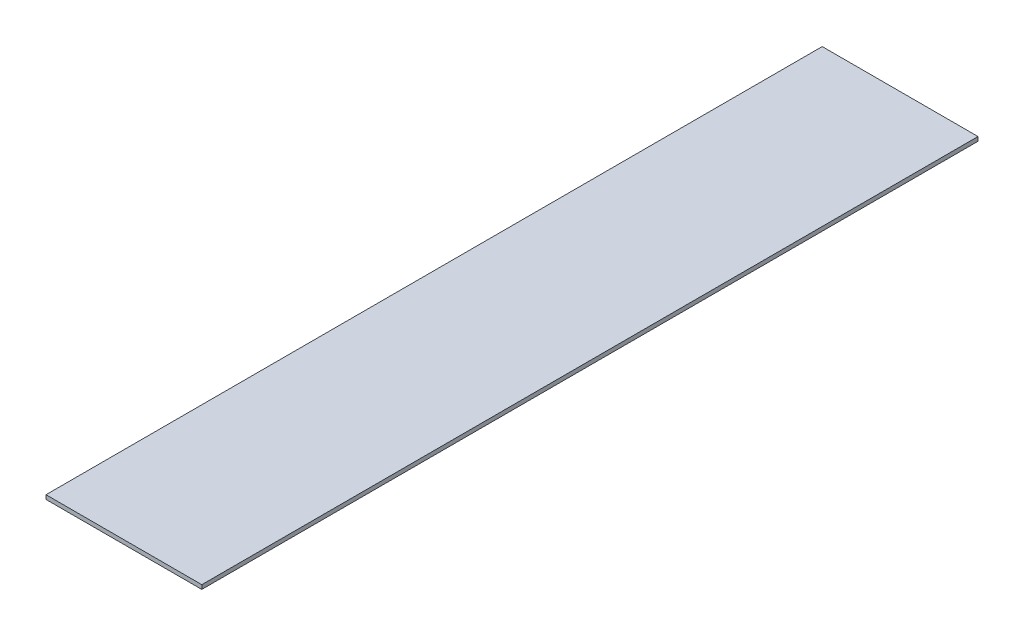
ISO-10303-21;
HEADER;
FILE_DESCRIPTION(('STEP AP214'),'2;1');
FILE_NAME('part.step','',(''),(''),'','','');
FILE_SCHEMA(('AUTOMOTIVE_DESIGN { 1 0 10303 214 1 1 1 1 }'));
ENDSEC;
DATA;
#1=APPLICATION_CONTEXT('core data for automotive mechanical design processes');
#2=APPLICATION_PROTOCOL_DEFINITION('international standard','automotive_design',2000,#1);
#3=PRODUCT_CONTEXT('',#1,'mechanical');
#4=PRODUCT('Part','Part','',(#3));
#5=PRODUCT_RELATED_PRODUCT_CATEGORY('part','',(#4));
#6=PRODUCT_DEFINITION_FORMATION('','',#4);
#7=PRODUCT_DEFINITION_CONTEXT('part definition',#1,'design');
#8=PRODUCT_DEFINITION('design','',#6,#7);
#9=PRODUCT_DEFINITION_SHAPE('','',#8);
#10=(LENGTH_UNIT() NAMED_UNIT(*) SI_UNIT(.MILLI.,.METRE.));
#11=(NAMED_UNIT(*) PLANE_ANGLE_UNIT() SI_UNIT($,.RADIAN.));
#12=(NAMED_UNIT(*) SI_UNIT($,.STERADIAN.) SOLID_ANGLE_UNIT());
#13=UNCERTAINTY_MEASURE_WITH_UNIT(LENGTH_MEASURE(1.E-05),#10,'distance_accuracy_value','');
#14=(GEOMETRIC_REPRESENTATION_CONTEXT(3) GLOBAL_UNCERTAINTY_ASSIGNED_CONTEXT((#13)) GLOBAL_UNIT_ASSIGNED_CONTEXT((#10,
#11,#12)) REPRESENTATION_CONTEXT('',''));
#15=CARTESIAN_POINT('',(0.,0.,0.));
#16=DIRECTION('',(0.,0.,1.));
#17=DIRECTION('',(1.,0.,0.));
#18=AXIS2_PLACEMENT_3D('',#15,#16,#17);
#19=CARTESIAN_POINT('',(0.,3.,0.));
#20=DIRECTION('',(1.,0.,0.));
#21=DIRECTION('',(0.,0.,-1.));
#22=AXIS2_PLACEMENT_3D('',#19,#20,#21);
#23=PLANE('',#22);
#24=DIRECTION('',(0.,0.,1.));
#25=VECTOR('',#24,1.);
#26=CARTESIAN_POINT('',(0.,0.,0.));
#27=LINE('',#26,#25);
#28=CARTESIAN_POINT('',(0.,0.,-563.));
#29=VERTEX_POINT('',#28);
#30=CARTESIAN_POINT('',(0.,0.,0.));
#31=VERTEX_POINT('',#30);
#32=EDGE_CURVE('E95',#29,#31,#27,.T.);
#33=ORIENTED_EDGE('',*,*,#32,.T.);
#34=DIRECTION('',(0.,-1.,0.));
#35=VECTOR('',#34,1.);
#36=CARTESIAN_POINT('',(0.,3.,0.));
#37=LINE('',#36,#35);
#38=CARTESIAN_POINT('',(0.,3.,0.));
#39=VERTEX_POINT('',#38);
#40=EDGE_CURVE('E11',#39,#31,#37,.T.);
#41=ORIENTED_EDGE('',*,*,#40,.F.);
#42=DIRECTION('',(0.,0.,1.));
#43=VECTOR('',#42,1.);
#44=CARTESIAN_POINT('',(0.,3.,0.));
#45=LINE('',#44,#43);
#46=CARTESIAN_POINT('',(0.,3.,-563.));
#47=VERTEX_POINT('',#46);
#48=EDGE_CURVE('E83',#47,#39,#45,.T.);
#49=ORIENTED_EDGE('',*,*,#48,.F.);
#50=DIRECTION('',(0.,-1.,0.));
#51=VECTOR('',#50,1.);
#52=CARTESIAN_POINT('',(0.,3.,-563.));
#53=LINE('',#52,#51);
#54=EDGE_CURVE('E91',#47,#29,#53,.T.);
#55=ORIENTED_EDGE('',*,*,#54,.T.);
#56=EDGE_LOOP('',(#33,#41,#49,#55));
#57=FACE_BOUND('',#56,.T.);
#58=ADVANCED_FACE('F32',(#57),#23,.F.);
#59=CARTESIAN_POINT('',(0.,3.,0.));
#60=DIRECTION('',(0.,0.,-1.));
#61=DIRECTION('',(-1.,0.,0.));
#62=AXIS2_PLACEMENT_3D('',#59,#60,#61);
#63=PLANE('',#62);
#64=DIRECTION('',(1.,0.,0.));
#65=VECTOR('',#64,1.);
#66=CARTESIAN_POINT('',(0.,0.,0.));
#67=LINE('',#66,#65);
#68=CARTESIAN_POINT('',(113.,0.,0.));
#69=VERTEX_POINT('',#68);
#70=EDGE_CURVE('E87',#31,#69,#67,.T.);
#71=ORIENTED_EDGE('',*,*,#70,.T.);
#72=DIRECTION('',(0.,-1.,0.));
#73=VECTOR('',#72,1.);
#74=CARTESIAN_POINT('',(113.,3.,0.));
#75=LINE('',#74,#73);
#76=CARTESIAN_POINT('',(113.,3.,0.));
#77=VERTEX_POINT('',#76);
#78=EDGE_CURVE('E40',#77,#69,#75,.T.);
#79=ORIENTED_EDGE('',*,*,#78,.F.);
#80=DIRECTION('',(1.,0.,0.));
#81=VECTOR('',#80,1.);
#82=CARTESIAN_POINT('',(0.,3.,0.));
#83=LINE('',#82,#81);
#84=EDGE_CURVE('E78',#39,#77,#83,.T.);
#85=ORIENTED_EDGE('',*,*,#84,.F.);
#86=ORIENTED_EDGE('',*,*,#40,.T.);
#87=EDGE_LOOP('',(#71,#79,#85,#86));
#88=FACE_BOUND('',#87,.T.);
#89=ADVANCED_FACE('F86',(#88),#63,.F.);
#90=CARTESIAN_POINT('',(113.,3.,0.));
#91=DIRECTION('',(-1.,0.,0.));
#92=DIRECTION('',(0.,0.,1.));
#93=AXIS2_PLACEMENT_3D('',#90,#91,#92);
#94=PLANE('',#93);
#95=DIRECTION('',(0.,0.,-1.));
#96=VECTOR('',#95,1.);
#97=CARTESIAN_POINT('',(113.,0.,0.));
#98=LINE('',#97,#96);
#99=CARTESIAN_POINT('',(113.,0.,-563.));
#100=VERTEX_POINT('',#99);
#101=EDGE_CURVE('E65',#69,#100,#98,.T.);
#102=ORIENTED_EDGE('',*,*,#101,.T.);
#103=DIRECTION('',(0.,-1.,0.));
#104=VECTOR('',#103,1.);
#105=CARTESIAN_POINT('',(113.,3.,-563.));
#106=LINE('',#105,#104);
#107=CARTESIAN_POINT('',(113.,3.,-563.));
#108=VERTEX_POINT('',#107);
#109=EDGE_CURVE('E88',#108,#100,#106,.T.);
#110=ORIENTED_EDGE('',*,*,#109,.F.);
#111=DIRECTION('',(0.,0.,-1.));
#112=VECTOR('',#111,1.);
#113=CARTESIAN_POINT('',(113.,3.,0.));
#114=LINE('',#113,#112);
#115=EDGE_CURVE('E81',#77,#108,#114,.T.);
#116=ORIENTED_EDGE('',*,*,#115,.F.);
#117=ORIENTED_EDGE('',*,*,#78,.T.);
#118=EDGE_LOOP('',(#102,#110,#116,#117));
#119=FACE_BOUND('',#118,.T.);
#120=ADVANCED_FACE('F89',(#119),#94,.F.);
#121=CARTESIAN_POINT('',(0.,3.,-563.));
#122=DIRECTION('',(0.,0.,1.));
#123=DIRECTION('',(1.,0.,0.));
#124=AXIS2_PLACEMENT_3D('',#121,#122,#123);
#125=PLANE('',#124);
#126=DIRECTION('',(-1.,0.,0.));
#127=VECTOR('',#126,1.);
#128=CARTESIAN_POINT('',(0.,0.,-563.));
#129=LINE('',#128,#127);
#130=EDGE_CURVE('E71',#100,#29,#129,.T.);
#131=ORIENTED_EDGE('',*,*,#130,.T.);
#132=ORIENTED_EDGE('',*,*,#54,.F.);
#133=DIRECTION('',(-1.,0.,0.));
#134=VECTOR('',#133,1.);
#135=CARTESIAN_POINT('',(0.,3.,-563.));
#136=LINE('',#135,#134);
#137=EDGE_CURVE('E48',#108,#47,#136,.T.);
#138=ORIENTED_EDGE('',*,*,#137,.F.);
#139=ORIENTED_EDGE('',*,*,#109,.T.);
#140=EDGE_LOOP('',(#131,#132,#138,#139));
#141=FACE_BOUND('',#140,.T.);
#142=ADVANCED_FACE('F102',(#141),#125,.F.);
#143=CARTESIAN_POINT('',(0.,3.,0.));
#144=DIRECTION('',(0.,-1.,0.));
#145=DIRECTION('',(0.,0.,-1.));
#146=AXIS2_PLACEMENT_3D('',#143,#144,#145);
#147=PLANE('',#146);
#148=ORIENTED_EDGE('',*,*,#48,.T.);
#149=ORIENTED_EDGE('',*,*,#84,.T.);
#150=ORIENTED_EDGE('',*,*,#115,.T.);
#151=ORIENTED_EDGE('',*,*,#137,.T.);
#152=EDGE_LOOP('',(#148,#149,#150,#151));
#153=FACE_BOUND('',#152,.T.);
#154=ADVANCED_FACE('F79',(#153),#147,.F.);
#155=CARTESIAN_POINT('',(0.,0.,0.));
#156=DIRECTION('',(0.,-1.,0.));
#157=DIRECTION('',(0.,0.,-1.));
#158=AXIS2_PLACEMENT_3D('',#155,#156,#157);
#159=PLANE('',#158);
#160=ORIENTED_EDGE('',*,*,#32,.F.);
#161=ORIENTED_EDGE('',*,*,#130,.F.);
#162=ORIENTED_EDGE('',*,*,#101,.F.);
#163=ORIENTED_EDGE('',*,*,#70,.F.);
#164=EDGE_LOOP('',(#160,#161,#162,#163));
#165=FACE_BOUND('',#164,.T.);
#166=ADVANCED_FACE('F105',(#165),#159,.T.);
#167=CLOSED_SHELL('',(#58,#89,#120,#142,#154,#166));
#168=MANIFOLD_SOLID_BREP('B2',#167);
#169=ADVANCED_BREP_SHAPE_REPRESENTATION('',(#18,#168),#14);
#170=SHAPE_DEFINITION_REPRESENTATION(#9,#169);
ENDSEC;
END-ISO-10303-21;
